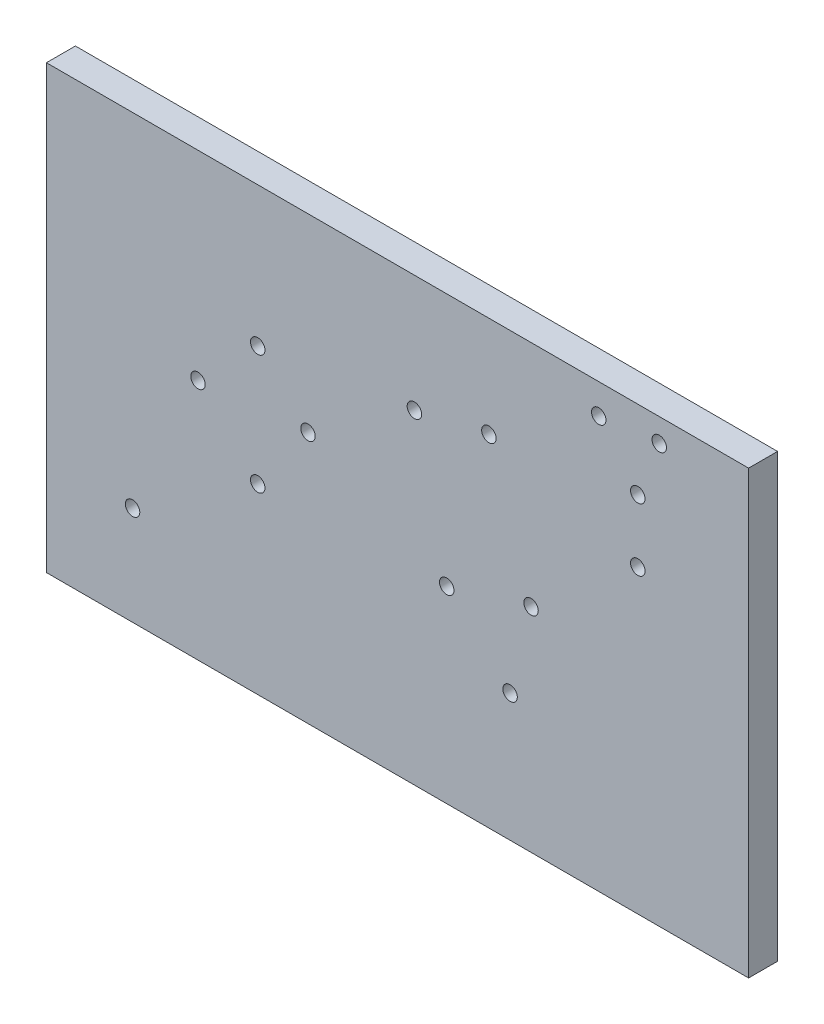
ISO-10303-21;
HEADER;
FILE_DESCRIPTION(('STEP AP214'),'2;1');
FILE_NAME('part.step','',(''),(''),'','','');
FILE_SCHEMA(('AUTOMOTIVE_DESIGN { 1 0 10303 214 1 1 1 1 }'));
ENDSEC;
DATA;
#1=APPLICATION_CONTEXT('core data for automotive mechanical design processes');
#2=APPLICATION_PROTOCOL_DEFINITION('international standard','automotive_design',2000,#1);
#3=PRODUCT_CONTEXT('',#1,'mechanical');
#4=PRODUCT('Part','Part','',(#3));
#5=PRODUCT_RELATED_PRODUCT_CATEGORY('part','',(#4));
#6=PRODUCT_DEFINITION_FORMATION('','',#4);
#7=PRODUCT_DEFINITION_CONTEXT('part definition',#1,'design');
#8=PRODUCT_DEFINITION('design','',#6,#7);
#9=PRODUCT_DEFINITION_SHAPE('','',#8);
#10=(LENGTH_UNIT() NAMED_UNIT(*) SI_UNIT(.MILLI.,.METRE.));
#11=(NAMED_UNIT(*) PLANE_ANGLE_UNIT() SI_UNIT($,.RADIAN.));
#12=(NAMED_UNIT(*) SI_UNIT($,.STERADIAN.) SOLID_ANGLE_UNIT());
#13=UNCERTAINTY_MEASURE_WITH_UNIT(LENGTH_MEASURE(1.E-05),#10,'distance_accuracy_value','');
#14=(GEOMETRIC_REPRESENTATION_CONTEXT(3) GLOBAL_UNCERTAINTY_ASSIGNED_CONTEXT((#13)) GLOBAL_UNIT_ASSIGNED_CONTEXT((#10,
#11,#12)) REPRESENTATION_CONTEXT('',''));
#15=CARTESIAN_POINT('',(0.,0.,0.));
#16=DIRECTION('',(0.,0.,1.));
#17=DIRECTION('',(1.,0.,0.));
#18=AXIS2_PLACEMENT_3D('',#15,#16,#17);
#19=CARTESIAN_POINT('',(-152.4,0.,12.7));
#20=DIRECTION('',(1.,0.,0.));
#21=DIRECTION('',(0.,0.,-1.));
#22=AXIS2_PLACEMENT_3D('',#19,#20,#21);
#23=PLANE('',#22);
#24=DIRECTION('',(0.,-1.,0.));
#25=VECTOR('',#24,1.);
#26=CARTESIAN_POINT('',(-152.4,0.,0.));
#27=LINE('',#26,#25);
#28=CARTESIAN_POINT('',(-152.4,104.775,0.));
#29=VERTEX_POINT('',#28);
#30=CARTESIAN_POINT('',(-152.4,-88.9,0.));
#31=VERTEX_POINT('',#30);
#32=EDGE_CURVE('E79',#29,#31,#27,.T.);
#33=ORIENTED_EDGE('',*,*,#32,.T.);
#34=DIRECTION('',(0.,0.,-1.));
#35=VECTOR('',#34,1.);
#36=CARTESIAN_POINT('',(-152.4,-88.9,12.7));
#37=LINE('',#36,#35);
#38=CARTESIAN_POINT('',(-152.4,-88.9,12.7));
#39=VERTEX_POINT('',#38);
#40=EDGE_CURVE('E11',#39,#31,#37,.T.);
#41=ORIENTED_EDGE('',*,*,#40,.F.);
#42=DIRECTION('',(0.,-1.,0.));
#43=VECTOR('',#42,1.);
#44=CARTESIAN_POINT('',(-152.4,104.775,12.7));
#45=LINE('',#44,#43);
#46=CARTESIAN_POINT('',(-152.4,104.775,12.7));
#47=VERTEX_POINT('',#46);
#48=EDGE_CURVE('E84',#47,#39,#45,.T.);
#49=ORIENTED_EDGE('',*,*,#48,.F.);
#50=DIRECTION('',(0.,0.,-1.));
#51=VECTOR('',#50,1.);
#52=CARTESIAN_POINT('',(-152.4,104.775,12.7));
#53=LINE('',#52,#51);
#54=EDGE_CURVE('E100',#47,#29,#53,.T.);
#55=ORIENTED_EDGE('',*,*,#54,.T.);
#56=EDGE_LOOP('',(#33,#41,#49,#55));
#57=FACE_BOUND('',#56,.T.);
#58=ADVANCED_FACE('F40',(#57),#23,.F.);
#59=CARTESIAN_POINT('',(155.575,-88.9,12.7));
#60=DIRECTION('',(0.,1.,0.));
#61=DIRECTION('',(-1.,0.,0.));
#62=AXIS2_PLACEMENT_3D('',#59,#60,#61);
#63=PLANE('',#62);
#64=DIRECTION('',(1.,0.,0.));
#65=VECTOR('',#64,1.);
#66=CARTESIAN_POINT('',(155.575,-88.9,0.));
#67=LINE('',#66,#65);
#68=CARTESIAN_POINT('',(155.575,-88.9,0.));
#69=VERTEX_POINT('',#68);
#70=EDGE_CURVE('E96',#31,#69,#67,.T.);
#71=ORIENTED_EDGE('',*,*,#70,.T.);
#72=DIRECTION('',(0.,0.,-1.));
#73=VECTOR('',#72,1.);
#74=CARTESIAN_POINT('',(155.575,-88.9,12.7));
#75=LINE('',#74,#73);
#76=CARTESIAN_POINT('',(155.575,-88.9,12.7));
#77=VERTEX_POINT('',#76);
#78=EDGE_CURVE('E48',#77,#69,#75,.T.);
#79=ORIENTED_EDGE('',*,*,#78,.F.);
#80=DIRECTION('',(1.,0.,0.));
#81=VECTOR('',#80,1.);
#82=CARTESIAN_POINT('',(155.575,-88.9,12.7));
#83=LINE('',#82,#81);
#84=EDGE_CURVE('E87',#39,#77,#83,.T.);
#85=ORIENTED_EDGE('',*,*,#84,.F.);
#86=ORIENTED_EDGE('',*,*,#40,.T.);
#87=EDGE_LOOP('',(#71,#79,#85,#86));
#88=FACE_BOUND('',#87,.T.);
#89=ADVANCED_FACE('F95',(#88),#63,.F.);
#90=CARTESIAN_POINT('',(155.575,104.775,12.7));
#91=DIRECTION('',(-1.,0.,0.));
#92=DIRECTION('',(0.,-1.,0.));
#93=AXIS2_PLACEMENT_3D('',#90,#91,#92);
#94=PLANE('',#93);
#95=DIRECTION('',(0.,1.,0.));
#96=VECTOR('',#95,1.);
#97=CARTESIAN_POINT('',(155.575,104.775,0.));
#98=LINE('',#97,#96);
#99=CARTESIAN_POINT('',(155.575,104.775,0.));
#100=VERTEX_POINT('',#99);
#101=EDGE_CURVE('E72',#69,#100,#98,.T.);
#102=ORIENTED_EDGE('',*,*,#101,.T.);
#103=DIRECTION('',(0.,0.,-1.));
#104=VECTOR('',#103,1.);
#105=CARTESIAN_POINT('',(155.575,104.775,12.7));
#106=LINE('',#105,#104);
#107=CARTESIAN_POINT('',(155.575,104.775,12.7));
#108=VERTEX_POINT('',#107);
#109=EDGE_CURVE('E97',#108,#100,#106,.T.);
#110=ORIENTED_EDGE('',*,*,#109,.F.);
#111=DIRECTION('',(0.,1.,0.));
#112=VECTOR('',#111,1.);
#113=CARTESIAN_POINT('',(155.575,0.,12.7));
#114=LINE('',#113,#112);
#115=EDGE_CURVE('E91',#77,#108,#114,.T.);
#116=ORIENTED_EDGE('',*,*,#115,.F.);
#117=ORIENTED_EDGE('',*,*,#78,.T.);
#118=EDGE_LOOP('',(#102,#110,#116,#117));
#119=FACE_BOUND('',#118,.T.);
#120=ADVANCED_FACE('F98',(#119),#94,.F.);
#121=CARTESIAN_POINT('',(155.575,104.775,12.7));
#122=DIRECTION('',(0.,-1.,0.));
#123=DIRECTION('',(0.,0.,-1.));
#124=AXIS2_PLACEMENT_3D('',#121,#122,#123);
#125=PLANE('',#124);
#126=DIRECTION('',(-1.,0.,0.));
#127=VECTOR('',#126,1.);
#128=CARTESIAN_POINT('',(155.575,104.775,0.));
#129=LINE('',#128,#127);
#130=EDGE_CURVE('E108',#100,#29,#129,.T.);
#131=ORIENTED_EDGE('',*,*,#130,.T.);
#132=ORIENTED_EDGE('',*,*,#54,.F.);
#133=DIRECTION('',(-1.,0.,0.));
#134=VECTOR('',#133,1.);
#135=CARTESIAN_POINT('',(155.575,104.775,12.7));
#136=LINE('',#135,#134);
#137=EDGE_CURVE('E56',#108,#47,#136,.T.);
#138=ORIENTED_EDGE('',*,*,#137,.F.);
#139=ORIENTED_EDGE('',*,*,#109,.T.);
#140=EDGE_LOOP('',(#131,#132,#138,#139));
#141=FACE_BOUND('',#140,.T.);
#142=ADVANCED_FACE('F113',(#141),#125,.F.);
#143=CARTESIAN_POINT('',(0.,0.,12.7));
#144=DIRECTION('',(0.,0.,-1.));
#145=DIRECTION('',(-1.,0.,0.));
#146=AXIS2_PLACEMENT_3D('',#143,#144,#145);
#147=PLANE('',#146);
#148=CARTESIAN_POINT('',(89.8427544173106,91.6831549306651,12.7));
#149=DIRECTION('',(0.,0.,-1.));
#150=DIRECTION('',(-1.,0.,0.));
#151=AXIS2_PLACEMENT_3D('',#148,#149,#150);
#152=CIRCLE('',#151,3.175);
#153=CARTESIAN_POINT('',(86.6677544173106,91.6831549306651,12.7));
#154=VERTEX_POINT('',#153);
#155=EDGE_CURVE('E105',#154,#154,#152,.T.);
#156=ORIENTED_EDGE('',*,*,#155,.T.);
#157=EDGE_LOOP('',(#156));
#158=FACE_BOUND('',#157,.T.);
#159=CARTESIAN_POINT('',(106.975954285836,42.9003730016773,12.7));
#160=DIRECTION('',(0.,0.,-1.));
#161=DIRECTION('',(-1.,0.,0.));
#162=AXIS2_PLACEMENT_3D('',#159,#160,#161);
#163=CIRCLE('',#162,3.17500000000001);
#164=CARTESIAN_POINT('',(103.800954285836,42.9003730016773,12.7));
#165=VERTEX_POINT('',#164);
#166=EDGE_CURVE('E141',#165,#165,#163,.T.);
#167=ORIENTED_EDGE('',*,*,#166,.T.);
#168=EDGE_LOOP('',(#167));
#169=FACE_BOUND('',#168,.T.);
#170=CARTESIAN_POINT('',(116.37124616263,94.4995231151453,12.7));
#171=DIRECTION('',(0.,0.,-1.));
#172=DIRECTION('',(-1.,0.,0.));
#173=AXIS2_PLACEMENT_3D('',#170,#171,#172);
#174=CIRCLE('',#173,3.175);
#175=CARTESIAN_POINT('',(113.19624616263,94.4995231151453,12.7));
#176=VERTEX_POINT('',#175);
#177=EDGE_CURVE('E145',#176,#176,#174,.T.);
#178=ORIENTED_EDGE('',*,*,#177,.T.);
#179=EDGE_LOOP('',(#178));
#180=FACE_BOUND('',#179,.T.);
#181=CARTESIAN_POINT('',(-85.9273600900334,17.3217163504886,12.7));
#182=DIRECTION('',(0.,0.,-1.));
#183=DIRECTION('',(-1.,0.,0.));
#184=AXIS2_PLACEMENT_3D('',#181,#182,#183);
#185=CIRCLE('',#184,3.175);
#186=CARTESIAN_POINT('',(-89.1023600900334,17.3217163504886,12.7));
#187=VERTEX_POINT('',#186);
#188=EDGE_CURVE('E149',#187,#187,#185,.T.);
#189=ORIENTED_EDGE('',*,*,#188,.T.);
#190=EDGE_LOOP('',(#189));
#191=FACE_BOUND('',#190,.T.);
#192=CARTESIAN_POINT('',(-59.7336100900341,43.515466350489,12.7));
#193=DIRECTION('',(0.,0.,-1.));
#194=DIRECTION('',(-1.,0.,0.));
#195=AXIS2_PLACEMENT_3D('',#192,#193,#194);
#196=CIRCLE('',#195,3.175);
#197=CARTESIAN_POINT('',(-62.9086100900341,43.515466350489,12.7));
#198=VERTEX_POINT('',#197);
#199=EDGE_CURVE('E153',#198,#198,#196,.T.);
#200=ORIENTED_EDGE('',*,*,#199,.T.);
#201=EDGE_LOOP('',(#200));
#202=FACE_BOUND('',#201,.T.);
#203=CARTESIAN_POINT('',(-37.6721397056391,21.7500200000003,12.7));
#204=DIRECTION('',(0.,0.,-1.));
#205=DIRECTION('',(-1.,0.,0.));
#206=AXIS2_PLACEMENT_3D('',#203,#204,#205);
#207=CIRCLE('',#206,3.175);
#208=CARTESIAN_POINT('',(-40.8471397056391,21.7500200000003,12.7));
#209=VERTEX_POINT('',#208);
#210=EDGE_CURVE('E157',#209,#209,#207,.T.);
#211=ORIENTED_EDGE('',*,*,#210,.T.);
#212=EDGE_LOOP('',(#211));
#213=FACE_BOUND('',#212,.T.);
#214=CARTESIAN_POINT('',(106.975954285835,70.3958730016775,12.7));
#215=DIRECTION('',(0.,0.,-1.));
#216=DIRECTION('',(-1.,0.,0.));
#217=AXIS2_PLACEMENT_3D('',#214,#215,#216);
#218=CIRCLE('',#217,3.175);
#219=CARTESIAN_POINT('',(103.800954285836,70.3958730016775,12.7));
#220=VERTEX_POINT('',#219);
#221=EDGE_CURVE('E161',#220,#220,#218,.T.);
#222=ORIENTED_EDGE('',*,*,#221,.T.);
#223=EDGE_LOOP('',(#222));
#224=FACE_BOUND('',#223,.T.);
#225=CARTESIAN_POINT('',(-59.7336100900329,-8.87203364951103,12.7));
#226=DIRECTION('',(0.,0.,-1.));
#227=DIRECTION('',(-1.,0.,0.));
#228=AXIS2_PLACEMENT_3D('',#225,#226,#227);
#229=CIRCLE('',#228,3.175);
#230=CARTESIAN_POINT('',(-62.9086100900329,-8.87203364951103,12.7));
#231=VERTEX_POINT('',#230);
#232=EDGE_CURVE('E165',#231,#231,#229,.T.);
#233=ORIENTED_EDGE('',*,*,#232,.T.);
#234=EDGE_LOOP('',(#233));
#235=FACE_BOUND('',#234,.T.);
#236=CARTESIAN_POINT('',(-114.633914907093,-45.5103517781358,12.7));
#237=DIRECTION('',(0.,0.,-1.));
#238=DIRECTION('',(-1.,0.,0.));
#239=AXIS2_PLACEMENT_3D('',#236,#237,#238);
#240=CIRCLE('',#239,3.175);
#241=CARTESIAN_POINT('',(-117.808914907093,-45.5103517781358,12.7));
#242=VERTEX_POINT('',#241);
#243=EDGE_CURVE('E169',#242,#242,#240,.T.);
#244=ORIENTED_EDGE('',*,*,#243,.T.);
#245=EDGE_LOOP('',(#244));
#246=FACE_BOUND('',#245,.T.);
#247=CARTESIAN_POINT('',(50.9527074960952,-32.969269827929,12.7));
#248=DIRECTION('',(0.,0.,-1.));
#249=DIRECTION('',(-1.,0.,0.));
#250=AXIS2_PLACEMENT_3D('',#247,#248,#249);
#251=CIRCLE('',#250,3.17500000000001);
#252=CARTESIAN_POINT('',(47.7777074960952,-32.969269827929,12.7));
#253=VERTEX_POINT('',#252);
#254=EDGE_CURVE('E173',#253,#253,#251,.T.);
#255=ORIENTED_EDGE('',*,*,#254,.T.);
#256=EDGE_LOOP('',(#255));
#257=FACE_BOUND('',#256,.T.);
#258=CARTESIAN_POINT('',(23.1743468305506,-6.31941891399469,12.7));
#259=DIRECTION('',(0.,0.,-1.));
#260=DIRECTION('',(-1.,0.,0.));
#261=AXIS2_PLACEMENT_3D('',#258,#259,#260);
#262=CIRCLE('',#261,3.17500000000001);
#263=CARTESIAN_POINT('',(19.9993468305506,-6.31941891399469,12.7));
#264=VERTEX_POINT('',#263);
#265=EDGE_CURVE('E177',#264,#264,#262,.T.);
#266=ORIENTED_EDGE('',*,*,#265,.T.);
#267=EDGE_LOOP('',(#266));
#268=FACE_BOUND('',#267,.T.);
#269=CARTESIAN_POINT('',(8.98554570223415,53.4682251664342,12.7));
#270=DIRECTION('',(0.,0.,-1.));
#271=DIRECTION('',(-1.,0.,0.));
#272=AXIS2_PLACEMENT_3D('',#269,#270,#271);
#273=CIRCLE('',#272,3.175);
#274=CARTESIAN_POINT('',(5.81054570223415,53.4682251664342,12.7));
#275=VERTEX_POINT('',#274);
#276=EDGE_CURVE('E181',#275,#275,#273,.T.);
#277=ORIENTED_EDGE('',*,*,#276,.T.);
#278=EDGE_LOOP('',(#277));
#279=FACE_BOUND('',#278,.T.);
#280=CARTESIAN_POINT('',(41.6558745700877,60.6579209093653,12.7));
#281=DIRECTION('',(0.,0.,-1.));
#282=DIRECTION('',(-1.,0.,0.));
#283=AXIS2_PLACEMENT_3D('',#280,#281,#282);
#284=CIRCLE('',#283,3.175);
#285=CARTESIAN_POINT('',(38.4808745700877,60.6579209093653,12.7));
#286=VERTEX_POINT('',#285);
#287=EDGE_CURVE('E185',#286,#286,#284,.T.);
#288=ORIENTED_EDGE('',*,*,#287,.T.);
#289=EDGE_LOOP('',(#288));
#290=FACE_BOUND('',#289,.T.);
#291=CARTESIAN_POINT('',(60.1429750618578,4.41242164088624,12.7));
#292=DIRECTION('',(0.,0.,-1.));
#293=DIRECTION('',(-1.,0.,0.));
#294=AXIS2_PLACEMENT_3D('',#291,#292,#293);
#295=CIRCLE('',#294,3.17500000000001);
#296=CARTESIAN_POINT('',(56.9679750618578,4.41242164088624,12.7));
#297=VERTEX_POINT('',#296);
#298=EDGE_CURVE('E189',#297,#297,#295,.T.);
#299=ORIENTED_EDGE('',*,*,#298,.T.);
#300=EDGE_LOOP('',(#299));
#301=FACE_BOUND('',#300,.T.);
#302=ORIENTED_EDGE('',*,*,#48,.T.);
#303=ORIENTED_EDGE('',*,*,#84,.T.);
#304=ORIENTED_EDGE('',*,*,#115,.T.);
#305=ORIENTED_EDGE('',*,*,#137,.T.);
#306=EDGE_LOOP('',(#302,#303,#304,#305));
#307=FACE_BOUND('',#306,.T.);
#308=ADVANCED_FACE('F89',(#158,#169,#180,#191,#202,#213,#224,#235,#246,#257,#268,#279,#290,#301,
#307),#147,.F.);
#309=CARTESIAN_POINT('',(0.,0.,0.));
#310=DIRECTION('',(0.,0.,-1.));
#311=DIRECTION('',(-1.,0.,0.));
#312=AXIS2_PLACEMENT_3D('',#309,#310,#311);
#313=PLANE('',#312);
#314=CARTESIAN_POINT('',(89.8427544173106,91.6831549306651,0.));
#315=DIRECTION('',(0.,0.,1.));
#316=DIRECTION('',(1.,0.,0.));
#317=AXIS2_PLACEMENT_3D('',#314,#315,#316);
#318=CIRCLE('',#317,3.175);
#319=CARTESIAN_POINT('',(93.0177544173106,91.6831549306651,0.));
#320=VERTEX_POINT('',#319);
#321=EDGE_CURVE('E206',#320,#320,#318,.T.);
#322=ORIENTED_EDGE('',*,*,#321,.T.);
#323=EDGE_LOOP('',(#322));
#324=FACE_BOUND('',#323,.T.);
#325=CARTESIAN_POINT('',(106.975954285836,42.9003730016773,0.));
#326=DIRECTION('',(0.,0.,1.));
#327=DIRECTION('',(1.,0.,0.));
#328=AXIS2_PLACEMENT_3D('',#325,#326,#327);
#329=CIRCLE('',#328,3.17500000000001);
#330=CARTESIAN_POINT('',(110.150954285836,42.9003730016773,0.));
#331=VERTEX_POINT('',#330);
#332=EDGE_CURVE('E209',#331,#331,#329,.T.);
#333=ORIENTED_EDGE('',*,*,#332,.T.);
#334=EDGE_LOOP('',(#333));
#335=FACE_BOUND('',#334,.T.);
#336=CARTESIAN_POINT('',(116.37124616263,94.4995231151453,0.));
#337=DIRECTION('',(0.,0.,1.));
#338=DIRECTION('',(1.,0.,0.));
#339=AXIS2_PLACEMENT_3D('',#336,#337,#338);
#340=CIRCLE('',#339,3.175);
#341=CARTESIAN_POINT('',(119.54624616263,94.4995231151453,0.));
#342=VERTEX_POINT('',#341);
#343=EDGE_CURVE('E212',#342,#342,#340,.T.);
#344=ORIENTED_EDGE('',*,*,#343,.T.);
#345=EDGE_LOOP('',(#344));
#346=FACE_BOUND('',#345,.T.);
#347=CARTESIAN_POINT('',(-85.9273600900334,17.3217163504886,0.));
#348=DIRECTION('',(0.,0.,1.));
#349=DIRECTION('',(1.,0.,0.));
#350=AXIS2_PLACEMENT_3D('',#347,#348,#349);
#351=CIRCLE('',#350,3.175);
#352=CARTESIAN_POINT('',(-82.7523600900334,17.3217163504886,0.));
#353=VERTEX_POINT('',#352);
#354=EDGE_CURVE('E214',#353,#353,#351,.T.);
#355=ORIENTED_EDGE('',*,*,#354,.T.);
#356=EDGE_LOOP('',(#355));
#357=FACE_BOUND('',#356,.T.);
#358=CARTESIAN_POINT('',(-59.7336100900341,43.515466350489,0.));
#359=DIRECTION('',(0.,0.,1.));
#360=DIRECTION('',(1.,0.,0.));
#361=AXIS2_PLACEMENT_3D('',#358,#359,#360);
#362=CIRCLE('',#361,3.175);
#363=CARTESIAN_POINT('',(-56.5586100900341,43.515466350489,0.));
#364=VERTEX_POINT('',#363);
#365=EDGE_CURVE('E196',#364,#364,#362,.T.);
#366=ORIENTED_EDGE('',*,*,#365,.T.);
#367=EDGE_LOOP('',(#366));
#368=FACE_BOUND('',#367,.T.);
#369=CARTESIAN_POINT('',(-37.6721397056391,21.7500200000003,0.));
#370=DIRECTION('',(0.,0.,1.));
#371=DIRECTION('',(1.,0.,0.));
#372=AXIS2_PLACEMENT_3D('',#369,#370,#371);
#373=CIRCLE('',#372,3.175);
#374=CARTESIAN_POINT('',(-34.4971397056391,21.7500200000003,0.));
#375=VERTEX_POINT('',#374);
#376=EDGE_CURVE('E197',#375,#375,#373,.T.);
#377=ORIENTED_EDGE('',*,*,#376,.T.);
#378=EDGE_LOOP('',(#377));
#379=FACE_BOUND('',#378,.T.);
#380=CARTESIAN_POINT('',(106.975954285835,70.3958730016775,0.));
#381=DIRECTION('',(0.,0.,1.));
#382=DIRECTION('',(1.,0.,0.));
#383=AXIS2_PLACEMENT_3D('',#380,#381,#382);
#384=CIRCLE('',#383,3.175);
#385=CARTESIAN_POINT('',(110.150954285835,70.3958730016775,0.));
#386=VERTEX_POINT('',#385);
#387=EDGE_CURVE('E200',#386,#386,#384,.T.);
#388=ORIENTED_EDGE('',*,*,#387,.T.);
#389=EDGE_LOOP('',(#388));
#390=FACE_BOUND('',#389,.T.);
#391=CARTESIAN_POINT('',(-59.7336100900329,-8.87203364951103,0.));
#392=DIRECTION('',(0.,0.,1.));
#393=DIRECTION('',(1.,0.,0.));
#394=AXIS2_PLACEMENT_3D('',#391,#392,#393);
#395=CIRCLE('',#394,3.175);
#396=CARTESIAN_POINT('',(-56.5586100900329,-8.87203364951103,0.));
#397=VERTEX_POINT('',#396);
#398=EDGE_CURVE('E203',#397,#397,#395,.T.);
#399=ORIENTED_EDGE('',*,*,#398,.T.);
#400=EDGE_LOOP('',(#399));
#401=FACE_BOUND('',#400,.T.);
#402=CARTESIAN_POINT('',(-114.633914907093,-45.5103517781358,0.));
#403=DIRECTION('',(0.,0.,1.));
#404=DIRECTION('',(1.,0.,0.));
#405=AXIS2_PLACEMENT_3D('',#402,#403,#404);
#406=CIRCLE('',#405,3.175);
#407=CARTESIAN_POINT('',(-111.458914907093,-45.5103517781358,0.));
#408=VERTEX_POINT('',#407);
#409=EDGE_CURVE('E217',#408,#408,#406,.T.);
#410=ORIENTED_EDGE('',*,*,#409,.T.);
#411=EDGE_LOOP('',(#410));
#412=FACE_BOUND('',#411,.T.);
#413=CARTESIAN_POINT('',(50.9527074960952,-32.969269827929,0.));
#414=DIRECTION('',(0.,0.,1.));
#415=DIRECTION('',(1.,0.,0.));
#416=AXIS2_PLACEMENT_3D('',#413,#414,#415);
#417=CIRCLE('',#416,3.17500000000001);
#418=CARTESIAN_POINT('',(54.1277074960952,-32.969269827929,0.));
#419=VERTEX_POINT('',#418);
#420=EDGE_CURVE('E229',#419,#419,#417,.T.);
#421=ORIENTED_EDGE('',*,*,#420,.T.);
#422=EDGE_LOOP('',(#421));
#423=FACE_BOUND('',#422,.T.);
#424=CARTESIAN_POINT('',(23.1743468305506,-6.31941891399469,0.));
#425=DIRECTION('',(0.,0.,1.));
#426=DIRECTION('',(1.,0.,0.));
#427=AXIS2_PLACEMENT_3D('',#424,#425,#426);
#428=CIRCLE('',#427,3.17500000000001);
#429=CARTESIAN_POINT('',(26.3493468305506,-6.31941891399469,0.));
#430=VERTEX_POINT('',#429);
#431=EDGE_CURVE('E226',#430,#430,#428,.T.);
#432=ORIENTED_EDGE('',*,*,#431,.T.);
#433=EDGE_LOOP('',(#432));
#434=FACE_BOUND('',#433,.T.);
#435=CARTESIAN_POINT('',(8.98554570223415,53.4682251664342,0.));
#436=DIRECTION('',(0.,0.,1.));
#437=DIRECTION('',(1.,0.,0.));
#438=AXIS2_PLACEMENT_3D('',#435,#436,#437);
#439=CIRCLE('',#438,3.175);
#440=CARTESIAN_POINT('',(12.1605457022341,53.4682251664342,0.));
#441=VERTEX_POINT('',#440);
#442=EDGE_CURVE('E223',#441,#441,#439,.T.);
#443=ORIENTED_EDGE('',*,*,#442,.T.);
#444=EDGE_LOOP('',(#443));
#445=FACE_BOUND('',#444,.T.);
#446=CARTESIAN_POINT('',(41.6558745700877,60.6579209093653,0.));
#447=DIRECTION('',(0.,0.,1.));
#448=DIRECTION('',(1.,0.,0.));
#449=AXIS2_PLACEMENT_3D('',#446,#447,#448);
#450=CIRCLE('',#449,3.175);
#451=CARTESIAN_POINT('',(44.8308745700877,60.6579209093653,0.));
#452=VERTEX_POINT('',#451);
#453=EDGE_CURVE('E220',#452,#452,#450,.T.);
#454=ORIENTED_EDGE('',*,*,#453,.T.);
#455=EDGE_LOOP('',(#454));
#456=FACE_BOUND('',#455,.T.);
#457=CARTESIAN_POINT('',(60.1429750618578,4.41242164088624,0.));
#458=DIRECTION('',(0.,0.,1.));
#459=DIRECTION('',(1.,0.,0.));
#460=AXIS2_PLACEMENT_3D('',#457,#458,#459);
#461=CIRCLE('',#460,3.17500000000001);
#462=CARTESIAN_POINT('',(63.3179750618578,4.41242164088624,0.));
#463=VERTEX_POINT('',#462);
#464=EDGE_CURVE('E193',#463,#463,#461,.T.);
#465=ORIENTED_EDGE('',*,*,#464,.T.);
#466=EDGE_LOOP('',(#465));
#467=FACE_BOUND('',#466,.T.);
#468=ORIENTED_EDGE('',*,*,#32,.F.);
#469=ORIENTED_EDGE('',*,*,#130,.F.);
#470=ORIENTED_EDGE('',*,*,#101,.F.);
#471=ORIENTED_EDGE('',*,*,#70,.F.);
#472=EDGE_LOOP('',(#468,#469,#470,#471));
#473=FACE_BOUND('',#472,.T.);
#474=ADVANCED_FACE('F114',(#324,#335,#346,#357,#368,#379,#390,#401,#412,#423,#434,#445,#456,
#467,#473),#313,.T.);
#475=CARTESIAN_POINT('',(60.1429750618578,4.41242164088624,0.));
#476=DIRECTION('',(0.,0.,1.));
#477=DIRECTION('',(1.,0.,0.));
#478=AXIS2_PLACEMENT_3D('',#475,#476,#477);
#479=CYLINDRICAL_SURFACE('',#478,3.17500000000001);
#480=ORIENTED_EDGE('',*,*,#464,.F.);
#481=EDGE_LOOP('',(#480));
#482=FACE_BOUND('',#481,.T.);
#483=ORIENTED_EDGE('',*,*,#298,.F.);
#484=EDGE_LOOP('',(#483));
#485=FACE_BOUND('',#484,.T.);
#486=ADVANCED_FACE('F116',(#482,#485),#479,.F.);
#487=CARTESIAN_POINT('',(41.6558745700877,60.6579209093653,0.));
#488=DIRECTION('',(0.,0.,1.));
#489=DIRECTION('',(1.,0.,0.));
#490=AXIS2_PLACEMENT_3D('',#487,#488,#489);
#491=CYLINDRICAL_SURFACE('',#490,3.175);
#492=ORIENTED_EDGE('',*,*,#453,.F.);
#493=EDGE_LOOP('',(#492));
#494=FACE_BOUND('',#493,.T.);
#495=ORIENTED_EDGE('',*,*,#287,.F.);
#496=EDGE_LOOP('',(#495));
#497=FACE_BOUND('',#496,.T.);
#498=ADVANCED_FACE('F124',(#494,#497),#491,.F.);
#499=CARTESIAN_POINT('',(8.98554570223415,53.4682251664342,0.));
#500=DIRECTION('',(0.,0.,1.));
#501=DIRECTION('',(1.,0.,0.));
#502=AXIS2_PLACEMENT_3D('',#499,#500,#501);
#503=CYLINDRICAL_SURFACE('',#502,3.175);
#504=ORIENTED_EDGE('',*,*,#442,.F.);
#505=EDGE_LOOP('',(#504));
#506=FACE_BOUND('',#505,.T.);
#507=ORIENTED_EDGE('',*,*,#276,.F.);
#508=EDGE_LOOP('',(#507));
#509=FACE_BOUND('',#508,.T.);
#510=ADVANCED_FACE('F258',(#506,#509),#503,.F.);
#511=CARTESIAN_POINT('',(23.1743468305506,-6.31941891399469,0.));
#512=DIRECTION('',(0.,0.,1.));
#513=DIRECTION('',(1.,0.,0.));
#514=AXIS2_PLACEMENT_3D('',#511,#512,#513);
#515=CYLINDRICAL_SURFACE('',#514,3.17500000000001);
#516=ORIENTED_EDGE('',*,*,#431,.F.);
#517=EDGE_LOOP('',(#516));
#518=FACE_BOUND('',#517,.T.);
#519=ORIENTED_EDGE('',*,*,#265,.F.);
#520=EDGE_LOOP('',(#519));
#521=FACE_BOUND('',#520,.T.);
#522=ADVANCED_FACE('F264',(#518,#521),#515,.F.);
#523=CARTESIAN_POINT('',(50.9527074960952,-32.969269827929,0.));
#524=DIRECTION('',(0.,0.,1.));
#525=DIRECTION('',(1.,0.,0.));
#526=AXIS2_PLACEMENT_3D('',#523,#524,#525);
#527=CYLINDRICAL_SURFACE('',#526,3.17500000000001);
#528=ORIENTED_EDGE('',*,*,#420,.F.);
#529=EDGE_LOOP('',(#528));
#530=FACE_BOUND('',#529,.T.);
#531=ORIENTED_EDGE('',*,*,#254,.F.);
#532=EDGE_LOOP('',(#531));
#533=FACE_BOUND('',#532,.T.);
#534=ADVANCED_FACE('F241',(#530,#533),#527,.F.);
#535=CARTESIAN_POINT('',(-114.633914907093,-45.5103517781358,0.));
#536=DIRECTION('',(0.,0.,1.));
#537=DIRECTION('',(1.,0.,0.));
#538=AXIS2_PLACEMENT_3D('',#535,#536,#537);
#539=CYLINDRICAL_SURFACE('',#538,3.175);
#540=ORIENTED_EDGE('',*,*,#409,.F.);
#541=EDGE_LOOP('',(#540));
#542=FACE_BOUND('',#541,.T.);
#543=ORIENTED_EDGE('',*,*,#243,.F.);
#544=EDGE_LOOP('',(#543));
#545=FACE_BOUND('',#544,.T.);
#546=ADVANCED_FACE('F237',(#542,#545),#539,.F.);
#547=CARTESIAN_POINT('',(-59.7336100900329,-8.87203364951103,0.));
#548=DIRECTION('',(0.,0.,1.));
#549=DIRECTION('',(1.,0.,0.));
#550=AXIS2_PLACEMENT_3D('',#547,#548,#549);
#551=CYLINDRICAL_SURFACE('',#550,3.175);
#552=ORIENTED_EDGE('',*,*,#398,.F.);
#553=EDGE_LOOP('',(#552));
#554=FACE_BOUND('',#553,.T.);
#555=ORIENTED_EDGE('',*,*,#232,.F.);
#556=EDGE_LOOP('',(#555));
#557=FACE_BOUND('',#556,.T.);
#558=ADVANCED_FACE('F240',(#554,#557),#551,.F.);
#559=CARTESIAN_POINT('',(106.975954285835,70.3958730016775,0.));
#560=DIRECTION('',(0.,0.,1.));
#561=DIRECTION('',(1.,0.,0.));
#562=AXIS2_PLACEMENT_3D('',#559,#560,#561);
#563=CYLINDRICAL_SURFACE('',#562,3.175);
#564=ORIENTED_EDGE('',*,*,#387,.F.);
#565=EDGE_LOOP('',(#564));
#566=FACE_BOUND('',#565,.T.);
#567=ORIENTED_EDGE('',*,*,#221,.F.);
#568=EDGE_LOOP('',(#567));
#569=FACE_BOUND('',#568,.T.);
#570=ADVANCED_FACE('F287',(#566,#569),#563,.F.);
#571=CARTESIAN_POINT('',(-37.6721397056391,21.7500200000003,0.));
#572=DIRECTION('',(0.,0.,1.));
#573=DIRECTION('',(1.,0.,0.));
#574=AXIS2_PLACEMENT_3D('',#571,#572,#573);
#575=CYLINDRICAL_SURFACE('',#574,3.175);
#576=ORIENTED_EDGE('',*,*,#376,.F.);
#577=EDGE_LOOP('',(#576));
#578=FACE_BOUND('',#577,.T.);
#579=ORIENTED_EDGE('',*,*,#210,.F.);
#580=EDGE_LOOP('',(#579));
#581=FACE_BOUND('',#580,.T.);
#582=ADVANCED_FACE('F290',(#578,#581),#575,.F.);
#583=CARTESIAN_POINT('',(-59.7336100900341,43.515466350489,0.));
#584=DIRECTION('',(0.,0.,1.));
#585=DIRECTION('',(1.,0.,0.));
#586=AXIS2_PLACEMENT_3D('',#583,#584,#585);
#587=CYLINDRICAL_SURFACE('',#586,3.175);
#588=ORIENTED_EDGE('',*,*,#365,.F.);
#589=EDGE_LOOP('',(#588));
#590=FACE_BOUND('',#589,.T.);
#591=ORIENTED_EDGE('',*,*,#199,.F.);
#592=EDGE_LOOP('',(#591));
#593=FACE_BOUND('',#592,.T.);
#594=ADVANCED_FACE('F278',(#590,#593),#587,.F.);
#595=CARTESIAN_POINT('',(-85.9273600900334,17.3217163504886,0.));
#596=DIRECTION('',(0.,0.,1.));
#597=DIRECTION('',(1.,0.,0.));
#598=AXIS2_PLACEMENT_3D('',#595,#596,#597);
#599=CYLINDRICAL_SURFACE('',#598,3.175);
#600=ORIENTED_EDGE('',*,*,#354,.F.);
#601=EDGE_LOOP('',(#600));
#602=FACE_BOUND('',#601,.T.);
#603=ORIENTED_EDGE('',*,*,#188,.F.);
#604=EDGE_LOOP('',(#603));
#605=FACE_BOUND('',#604,.T.);
#606=ADVANCED_FACE('F274',(#602,#605),#599,.F.);
#607=CARTESIAN_POINT('',(116.37124616263,94.4995231151453,0.));
#608=DIRECTION('',(0.,0.,1.));
#609=DIRECTION('',(1.,0.,0.));
#610=AXIS2_PLACEMENT_3D('',#607,#608,#609);
#611=CYLINDRICAL_SURFACE('',#610,3.175);
#612=ORIENTED_EDGE('',*,*,#343,.F.);
#613=EDGE_LOOP('',(#612));
#614=FACE_BOUND('',#613,.T.);
#615=ORIENTED_EDGE('',*,*,#177,.F.);
#616=EDGE_LOOP('',(#615));
#617=FACE_BOUND('',#616,.T.);
#618=ADVANCED_FACE('F270',(#614,#617),#611,.F.);
#619=CARTESIAN_POINT('',(106.975954285836,42.9003730016773,0.));
#620=DIRECTION('',(0.,0.,1.));
#621=DIRECTION('',(1.,0.,0.));
#622=AXIS2_PLACEMENT_3D('',#619,#620,#621);
#623=CYLINDRICAL_SURFACE('',#622,3.17500000000001);
#624=ORIENTED_EDGE('',*,*,#332,.F.);
#625=EDGE_LOOP('',(#624));
#626=FACE_BOUND('',#625,.T.);
#627=ORIENTED_EDGE('',*,*,#166,.F.);
#628=EDGE_LOOP('',(#627));
#629=FACE_BOUND('',#628,.T.);
#630=ADVANCED_FACE('F273',(#626,#629),#623,.F.);
#631=CARTESIAN_POINT('',(89.8427544173106,91.6831549306651,0.));
#632=DIRECTION('',(0.,0.,1.));
#633=DIRECTION('',(1.,0.,0.));
#634=AXIS2_PLACEMENT_3D('',#631,#632,#633);
#635=CYLINDRICAL_SURFACE('',#634,3.175);
#636=ORIENTED_EDGE('',*,*,#321,.F.);
#637=EDGE_LOOP('',(#636));
#638=FACE_BOUND('',#637,.T.);
#639=ORIENTED_EDGE('',*,*,#155,.F.);
#640=EDGE_LOOP('',(#639));
#641=FACE_BOUND('',#640,.T.);
#642=ADVANCED_FACE('F280',(#638,#641),#635,.F.);
#643=CLOSED_SHELL('',(#58,#89,#120,#142,#308,#474,#486,#498,#510,#522,#534,#546,#558,#570,#582,
#594,#606,#618,#630,#642));
#644=MANIFOLD_SOLID_BREP('B2',#643);
#645=ADVANCED_BREP_SHAPE_REPRESENTATION('',(#18,#644),#14);
#646=SHAPE_DEFINITION_REPRESENTATION(#9,#645);
ENDSEC;
END-ISO-10303-21;
